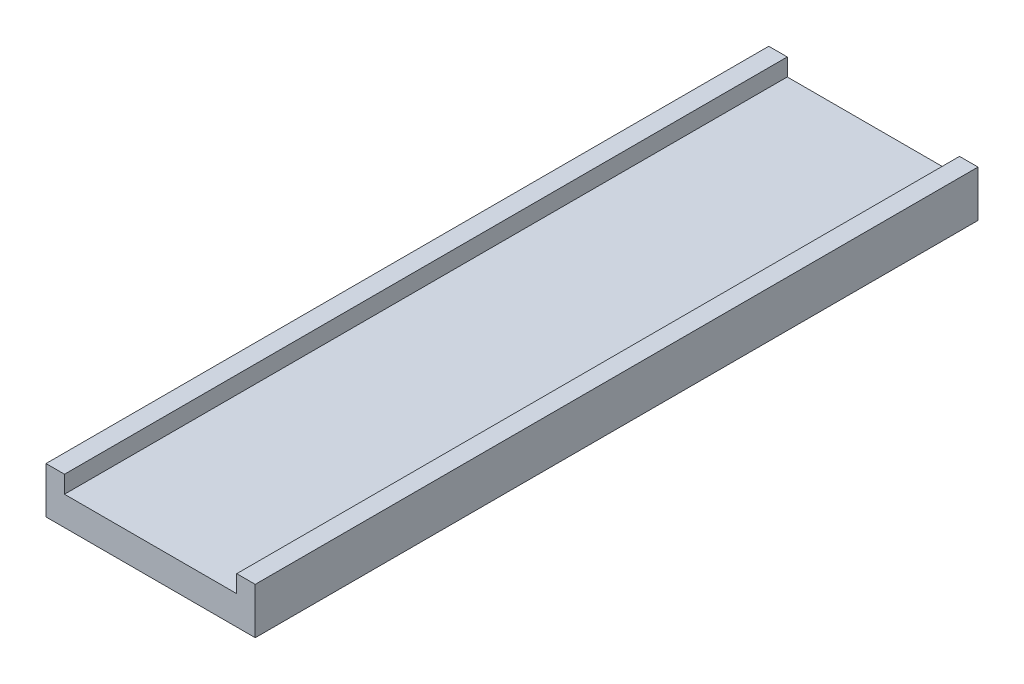
ISO-10303-21;
HEADER;
FILE_DESCRIPTION(('STEP AP214'),'2;1');
FILE_NAME('part.step','',(''),(''),'','','');
FILE_SCHEMA(('AUTOMOTIVE_DESIGN { 1 0 10303 214 1 1 1 1 }'));
ENDSEC;
DATA;
#1=APPLICATION_CONTEXT('core data for automotive mechanical design processes');
#2=APPLICATION_PROTOCOL_DEFINITION('international standard','automotive_design',2000,#1);
#3=PRODUCT_CONTEXT('',#1,'mechanical');
#4=PRODUCT('Part','Part','',(#3));
#5=PRODUCT_RELATED_PRODUCT_CATEGORY('part','',(#4));
#6=PRODUCT_DEFINITION_FORMATION('','',#4);
#7=PRODUCT_DEFINITION_CONTEXT('part definition',#1,'design');
#8=PRODUCT_DEFINITION('design','',#6,#7);
#9=PRODUCT_DEFINITION_SHAPE('','',#8);
#10=(LENGTH_UNIT() NAMED_UNIT(*) SI_UNIT(.MILLI.,.METRE.));
#11=(NAMED_UNIT(*) PLANE_ANGLE_UNIT() SI_UNIT($,.RADIAN.));
#12=(NAMED_UNIT(*) SI_UNIT($,.STERADIAN.) SOLID_ANGLE_UNIT());
#13=UNCERTAINTY_MEASURE_WITH_UNIT(LENGTH_MEASURE(1.E-05),#10,'distance_accuracy_value','');
#14=(GEOMETRIC_REPRESENTATION_CONTEXT(3) GLOBAL_UNCERTAINTY_ASSIGNED_CONTEXT((#13)) GLOBAL_UNIT_ASSIGNED_CONTEXT((#10,
#11,#12)) REPRESENTATION_CONTEXT('',''));
#15=CARTESIAN_POINT('',(0.,0.,0.));
#16=DIRECTION('',(0.,0.,1.));
#17=DIRECTION('',(1.,0.,0.));
#18=AXIS2_PLACEMENT_3D('',#15,#16,#17);
#19=CARTESIAN_POINT('',(-36.1861250125035,16.,250.));
#20=DIRECTION('',(1.,0.,0.));
#21=DIRECTION('',(0.,0.,-1.));
#22=AXIS2_PLACEMENT_3D('',#19,#20,#21);
#23=PLANE('',#22);
#24=DIRECTION('',(0.,-1.,0.));
#25=VECTOR('',#24,1.);
#26=CARTESIAN_POINT('',(-36.1861250125035,16.,0.));
#27=LINE('',#26,#25);
#28=CARTESIAN_POINT('',(-36.1861250125035,16.,0.));
#29=VERTEX_POINT('',#28);
#30=CARTESIAN_POINT('',(-36.1861250125035,0.,0.));
#31=VERTEX_POINT('',#30);
#32=EDGE_CURVE('E131',#29,#31,#27,.T.);
#33=ORIENTED_EDGE('',*,*,#32,.T.);
#34=DIRECTION('',(0.,0.,-1.));
#35=VECTOR('',#34,1.);
#36=CARTESIAN_POINT('',(-36.1861250125035,0.,250.));
#37=LINE('',#36,#35);
#38=CARTESIAN_POINT('',(-36.1861250125035,0.,250.));
#39=VERTEX_POINT('',#38);
#40=EDGE_CURVE('E11',#39,#31,#37,.T.);
#41=ORIENTED_EDGE('',*,*,#40,.F.);
#42=DIRECTION('',(0.,-1.,0.));
#43=VECTOR('',#42,1.);
#44=CARTESIAN_POINT('',(-36.1861250125035,16.,250.));
#45=LINE('',#44,#43);
#46=CARTESIAN_POINT('',(-36.1861250125035,16.,250.));
#47=VERTEX_POINT('',#46);
#48=EDGE_CURVE('E145',#47,#39,#45,.T.);
#49=ORIENTED_EDGE('',*,*,#48,.F.);
#50=DIRECTION('',(0.,0.,-1.));
#51=VECTOR('',#50,1.);
#52=CARTESIAN_POINT('',(-36.1861250125035,16.,250.));
#53=LINE('',#52,#51);
#54=EDGE_CURVE('E127',#47,#29,#53,.T.);
#55=ORIENTED_EDGE('',*,*,#54,.T.);
#56=EDGE_LOOP('',(#33,#41,#49,#55));
#57=FACE_BOUND('',#56,.T.);
#58=ADVANCED_FACE('F35',(#57),#23,.F.);
#59=CARTESIAN_POINT('',(-36.1861250125035,0.,250.));
#60=DIRECTION('',(0.,1.,0.));
#61=DIRECTION('',(-1.,0.,0.));
#62=AXIS2_PLACEMENT_3D('',#59,#60,#61);
#63=PLANE('',#62);
#64=DIRECTION('',(1.,0.,0.));
#65=VECTOR('',#64,1.);
#66=CARTESIAN_POINT('',(-36.1861250125035,0.,0.));
#67=LINE('',#66,#65);
#68=CARTESIAN_POINT('',(36.1861250125035,0.,0.));
#69=VERTEX_POINT('',#68);
#70=EDGE_CURVE('E134',#31,#69,#67,.T.);
#71=ORIENTED_EDGE('',*,*,#70,.T.);
#72=DIRECTION('',(0.,0.,-1.));
#73=VECTOR('',#72,1.);
#74=CARTESIAN_POINT('',(36.1861250125035,0.,250.));
#75=LINE('',#74,#73);
#76=CARTESIAN_POINT('',(36.1861250125035,0.,250.));
#77=VERTEX_POINT('',#76);
#78=EDGE_CURVE('E43',#77,#69,#75,.T.);
#79=ORIENTED_EDGE('',*,*,#78,.F.);
#80=DIRECTION('',(1.,0.,0.));
#81=VECTOR('',#80,1.);
#82=CARTESIAN_POINT('',(-36.1861250125035,0.,250.));
#83=LINE('',#82,#81);
#84=EDGE_CURVE('E94',#39,#77,#83,.T.);
#85=ORIENTED_EDGE('',*,*,#84,.F.);
#86=ORIENTED_EDGE('',*,*,#40,.T.);
#87=EDGE_LOOP('',(#71,#79,#85,#86));
#88=FACE_BOUND('',#87,.T.);
#89=ADVANCED_FACE('F180',(#88),#63,.F.);
#90=CARTESIAN_POINT('',(36.1861250125035,0.,250.));
#91=DIRECTION('',(-1.,0.,0.));
#92=DIRECTION('',(0.,-1.,0.));
#93=AXIS2_PLACEMENT_3D('',#90,#91,#92);
#94=PLANE('',#93);
#95=DIRECTION('',(0.,1.,0.));
#96=VECTOR('',#95,1.);
#97=CARTESIAN_POINT('',(36.1861250125035,0.,0.));
#98=LINE('',#97,#96);
#99=CARTESIAN_POINT('',(36.1861250125035,16.,0.));
#100=VERTEX_POINT('',#99);
#101=EDGE_CURVE('E136',#69,#100,#98,.T.);
#102=ORIENTED_EDGE('',*,*,#101,.T.);
#103=DIRECTION('',(0.,0.,-1.));
#104=VECTOR('',#103,1.);
#105=CARTESIAN_POINT('',(36.1861250125035,16.,250.));
#106=LINE('',#105,#104);
#107=CARTESIAN_POINT('',(36.1861250125035,16.,250.));
#108=VERTEX_POINT('',#107);
#109=EDGE_CURVE('E152',#108,#100,#106,.T.);
#110=ORIENTED_EDGE('',*,*,#109,.F.);
#111=DIRECTION('',(0.,1.,0.));
#112=VECTOR('',#111,1.);
#113=CARTESIAN_POINT('',(36.1861250125035,0.,250.));
#114=LINE('',#113,#112);
#115=EDGE_CURVE('E160',#77,#108,#114,.T.);
#116=ORIENTED_EDGE('',*,*,#115,.F.);
#117=ORIENTED_EDGE('',*,*,#78,.T.);
#118=EDGE_LOOP('',(#102,#110,#116,#117));
#119=FACE_BOUND('',#118,.T.);
#120=ADVANCED_FACE('F158',(#119),#94,.F.);
#121=CARTESIAN_POINT('',(36.1861250125035,16.,250.));
#122=DIRECTION('',(0.,-1.,0.));
#123=DIRECTION('',(0.,0.,-1.));
#124=AXIS2_PLACEMENT_3D('',#121,#122,#123);
#125=PLANE('',#124);
#126=DIRECTION('',(-1.,0.,0.));
#127=VECTOR('',#126,1.);
#128=CARTESIAN_POINT('',(36.1861250125035,16.,0.));
#129=LINE('',#128,#127);
#130=CARTESIAN_POINT('',(29.7887616867042,16.,0.));
#131=VERTEX_POINT('',#130);
#132=EDGE_CURVE('E138',#100,#131,#129,.T.);
#133=ORIENTED_EDGE('',*,*,#132,.T.);
#134=DIRECTION('',(0.,0.,-1.));
#135=VECTOR('',#134,1.);
#136=CARTESIAN_POINT('',(29.7887616867042,16.,250.));
#137=LINE('',#136,#135);
#138=CARTESIAN_POINT('',(29.7887616867042,16.,250.));
#139=VERTEX_POINT('',#138);
#140=EDGE_CURVE('E149',#139,#131,#137,.T.);
#141=ORIENTED_EDGE('',*,*,#140,.F.);
#142=DIRECTION('',(-1.,0.,0.));
#143=VECTOR('',#142,1.);
#144=CARTESIAN_POINT('',(36.1861250125035,16.,250.));
#145=LINE('',#144,#143);
#146=EDGE_CURVE('E172',#108,#139,#145,.T.);
#147=ORIENTED_EDGE('',*,*,#146,.F.);
#148=ORIENTED_EDGE('',*,*,#109,.T.);
#149=EDGE_LOOP('',(#133,#141,#147,#148));
#150=FACE_BOUND('',#149,.T.);
#151=ADVANCED_FACE('F168',(#150),#125,.F.);
#152=CARTESIAN_POINT('',(29.7887616867042,16.,250.));
#153=DIRECTION('',(1.,0.,0.));
#154=DIRECTION('',(0.,1.,0.));
#155=AXIS2_PLACEMENT_3D('',#152,#153,#154);
#156=PLANE('',#155);
#157=DIRECTION('',(0.,-1.,0.));
#158=VECTOR('',#157,1.);
#159=CARTESIAN_POINT('',(29.7887616867042,16.,0.));
#160=LINE('',#159,#158);
#161=CARTESIAN_POINT('',(29.7887616867042,10.,0.));
#162=VERTEX_POINT('',#161);
#163=EDGE_CURVE('E140',#131,#162,#160,.T.);
#164=ORIENTED_EDGE('',*,*,#163,.T.);
#165=DIRECTION('',(0.,0.,-1.));
#166=VECTOR('',#165,1.);
#167=CARTESIAN_POINT('',(29.7887616867042,10.,250.));
#168=LINE('',#167,#166);
#169=CARTESIAN_POINT('',(29.7887616867042,10.,250.));
#170=VERTEX_POINT('',#169);
#171=EDGE_CURVE('E122',#170,#162,#168,.T.);
#172=ORIENTED_EDGE('',*,*,#171,.F.);
#173=DIRECTION('',(0.,-1.,0.));
#174=VECTOR('',#173,1.);
#175=CARTESIAN_POINT('',(29.7887616867042,16.,250.));
#176=LINE('',#175,#174);
#177=EDGE_CURVE('E113',#139,#170,#176,.T.);
#178=ORIENTED_EDGE('',*,*,#177,.F.);
#179=ORIENTED_EDGE('',*,*,#140,.T.);
#180=EDGE_LOOP('',(#164,#172,#178,#179));
#181=FACE_BOUND('',#180,.T.);
#182=ADVANCED_FACE('F171',(#181),#156,.F.);
#183=CARTESIAN_POINT('',(29.7887616867042,10.,250.));
#184=DIRECTION('',(0.,-1.,0.));
#185=DIRECTION('',(1.,0.,0.));
#186=AXIS2_PLACEMENT_3D('',#183,#184,#185);
#187=PLANE('',#186);
#188=DIRECTION('',(-1.,0.,0.));
#189=VECTOR('',#188,1.);
#190=CARTESIAN_POINT('',(29.7887616867042,10.,0.));
#191=LINE('',#190,#189);
#192=CARTESIAN_POINT('',(-29.7887616867042,10.,0.));
#193=VERTEX_POINT('',#192);
#194=EDGE_CURVE('E121',#162,#193,#191,.T.);
#195=ORIENTED_EDGE('',*,*,#194,.T.);
#196=DIRECTION('',(0.,0.,-1.));
#197=VECTOR('',#196,1.);
#198=CARTESIAN_POINT('',(-29.7887616867042,10.,250.));
#199=LINE('',#198,#197);
#200=CARTESIAN_POINT('',(-29.7887616867042,10.,250.));
#201=VERTEX_POINT('',#200);
#202=EDGE_CURVE('E118',#201,#193,#199,.T.);
#203=ORIENTED_EDGE('',*,*,#202,.F.);
#204=DIRECTION('',(-1.,0.,0.));
#205=VECTOR('',#204,1.);
#206=CARTESIAN_POINT('',(29.7887616867042,10.,250.));
#207=LINE('',#206,#205);
#208=EDGE_CURVE('E107',#170,#201,#207,.T.);
#209=ORIENTED_EDGE('',*,*,#208,.F.);
#210=ORIENTED_EDGE('',*,*,#171,.T.);
#211=EDGE_LOOP('',(#195,#203,#209,#210));
#212=FACE_BOUND('',#211,.T.);
#213=ADVANCED_FACE('F119',(#212),#187,.F.);
#214=CARTESIAN_POINT('',(-29.7887616867042,10.,250.));
#215=DIRECTION('',(-1.,0.,0.));
#216=DIRECTION('',(0.,0.,1.));
#217=AXIS2_PLACEMENT_3D('',#214,#215,#216);
#218=PLANE('',#217);
#219=DIRECTION('',(0.,1.,0.));
#220=VECTOR('',#219,1.);
#221=CARTESIAN_POINT('',(-29.7887616867042,10.,0.));
#222=LINE('',#221,#220);
#223=CARTESIAN_POINT('',(-29.7887616867042,16.,0.));
#224=VERTEX_POINT('',#223);
#225=EDGE_CURVE('E80',#193,#224,#222,.T.);
#226=ORIENTED_EDGE('',*,*,#225,.T.);
#227=DIRECTION('',(0.,0.,-1.));
#228=VECTOR('',#227,1.);
#229=CARTESIAN_POINT('',(-29.7887616867042,16.,250.));
#230=LINE('',#229,#228);
#231=CARTESIAN_POINT('',(-29.7887616867042,16.,250.));
#232=VERTEX_POINT('',#231);
#233=EDGE_CURVE('E123',#232,#224,#230,.T.);
#234=ORIENTED_EDGE('',*,*,#233,.F.);
#235=DIRECTION('',(0.,1.,0.));
#236=VECTOR('',#235,1.);
#237=CARTESIAN_POINT('',(-29.7887616867042,10.,250.));
#238=LINE('',#237,#236);
#239=EDGE_CURVE('E111',#201,#232,#238,.T.);
#240=ORIENTED_EDGE('',*,*,#239,.F.);
#241=ORIENTED_EDGE('',*,*,#202,.T.);
#242=EDGE_LOOP('',(#226,#234,#240,#241));
#243=FACE_BOUND('',#242,.T.);
#244=ADVANCED_FACE('F125',(#243),#218,.F.);
#245=CARTESIAN_POINT('',(-29.7887616867042,16.,250.));
#246=DIRECTION('',(0.,-1.,0.));
#247=DIRECTION('',(0.,0.,-1.));
#248=AXIS2_PLACEMENT_3D('',#245,#246,#247);
#249=PLANE('',#248);
#250=DIRECTION('',(-1.,0.,0.));
#251=VECTOR('',#250,1.);
#252=CARTESIAN_POINT('',(-29.7887616867042,16.,0.));
#253=LINE('',#252,#251);
#254=EDGE_CURVE('E86',#224,#29,#253,.T.);
#255=ORIENTED_EDGE('',*,*,#254,.T.);
#256=ORIENTED_EDGE('',*,*,#54,.F.);
#257=DIRECTION('',(-1.,0.,0.));
#258=VECTOR('',#257,1.);
#259=CARTESIAN_POINT('',(-29.7887616867042,16.,250.));
#260=LINE('',#259,#258);
#261=EDGE_CURVE('E51',#232,#47,#260,.T.);
#262=ORIENTED_EDGE('',*,*,#261,.F.);
#263=ORIENTED_EDGE('',*,*,#233,.T.);
#264=EDGE_LOOP('',(#255,#256,#262,#263));
#265=FACE_BOUND('',#264,.T.);
#266=ADVANCED_FACE('F196',(#265),#249,.F.);
#267=CARTESIAN_POINT('',(0.,0.,250.));
#268=DIRECTION('',(0.,0.,1.));
#269=DIRECTION('',(1.,0.,0.));
#270=AXIS2_PLACEMENT_3D('',#267,#268,#269);
#271=PLANE('',#270);
#272=ORIENTED_EDGE('',*,*,#48,.T.);
#273=ORIENTED_EDGE('',*,*,#84,.T.);
#274=ORIENTED_EDGE('',*,*,#115,.T.);
#275=ORIENTED_EDGE('',*,*,#146,.T.);
#276=ORIENTED_EDGE('',*,*,#177,.T.);
#277=ORIENTED_EDGE('',*,*,#208,.T.);
#278=ORIENTED_EDGE('',*,*,#239,.T.);
#279=ORIENTED_EDGE('',*,*,#261,.T.);
#280=EDGE_LOOP('',(#272,#273,#274,#275,#276,#277,#278,#279));
#281=FACE_BOUND('',#280,.T.);
#282=ADVANCED_FACE('F109',(#281),#271,.T.);
#283=CARTESIAN_POINT('',(0.,0.,0.));
#284=DIRECTION('',(0.,0.,1.));
#285=DIRECTION('',(1.,0.,0.));
#286=AXIS2_PLACEMENT_3D('',#283,#284,#285);
#287=PLANE('',#286);
#288=ORIENTED_EDGE('',*,*,#32,.F.);
#289=ORIENTED_EDGE('',*,*,#254,.F.);
#290=ORIENTED_EDGE('',*,*,#225,.F.);
#291=ORIENTED_EDGE('',*,*,#194,.F.);
#292=ORIENTED_EDGE('',*,*,#163,.F.);
#293=ORIENTED_EDGE('',*,*,#132,.F.);
#294=ORIENTED_EDGE('',*,*,#101,.F.);
#295=ORIENTED_EDGE('',*,*,#70,.F.);
#296=EDGE_LOOP('',(#288,#289,#290,#291,#292,#293,#294,#295));
#297=FACE_BOUND('',#296,.T.);
#298=ADVANCED_FACE('F164',(#297),#287,.F.);
#299=CLOSED_SHELL('',(#58,#89,#120,#151,#182,#213,#244,#266,#282,#298));
#300=MANIFOLD_SOLID_BREP('B2',#299);
#301=ADVANCED_BREP_SHAPE_REPRESENTATION('',(#18,#300),#14);
#302=SHAPE_DEFINITION_REPRESENTATION(#9,#301);
ENDSEC;
END-ISO-10303-21;
